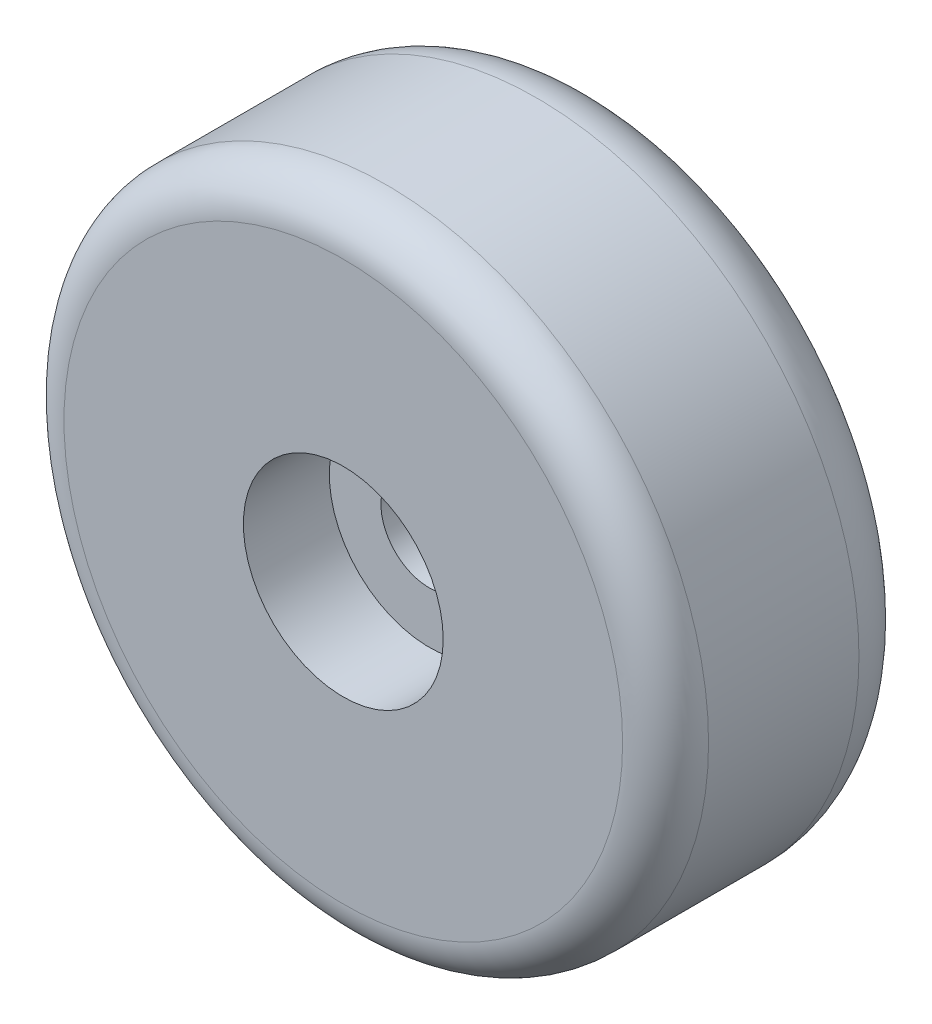
ISO-10303-21;
HEADER;
FILE_DESCRIPTION(('STEP AP214'),'2;1');
FILE_NAME('part.step','',(''),(''),'','','');
FILE_SCHEMA(('AUTOMOTIVE_DESIGN { 1 0 10303 214 1 1 1 1 }'));
ENDSEC;
DATA;
#1=APPLICATION_CONTEXT('core data for automotive mechanical design processes');
#2=APPLICATION_PROTOCOL_DEFINITION('international standard','automotive_design',2000,#1);
#3=PRODUCT_CONTEXT('',#1,'mechanical');
#4=PRODUCT('Part','Part','',(#3));
#5=PRODUCT_RELATED_PRODUCT_CATEGORY('part','',(#4));
#6=PRODUCT_DEFINITION_FORMATION('','',#4);
#7=PRODUCT_DEFINITION_CONTEXT('part definition',#1,'design');
#8=PRODUCT_DEFINITION('design','',#6,#7);
#9=PRODUCT_DEFINITION_SHAPE('','',#8);
#10=(LENGTH_UNIT() NAMED_UNIT(*) SI_UNIT(.MILLI.,.METRE.));
#11=(NAMED_UNIT(*) PLANE_ANGLE_UNIT() SI_UNIT($,.RADIAN.));
#12=(NAMED_UNIT(*) SI_UNIT($,.STERADIAN.) SOLID_ANGLE_UNIT());
#13=UNCERTAINTY_MEASURE_WITH_UNIT(LENGTH_MEASURE(1.E-05),#10,'distance_accuracy_value','');
#14=(GEOMETRIC_REPRESENTATION_CONTEXT(3) GLOBAL_UNCERTAINTY_ASSIGNED_CONTEXT((#13)) GLOBAL_UNIT_ASSIGNED_CONTEXT((#10,
#11,#12)) REPRESENTATION_CONTEXT('',''));
#15=CARTESIAN_POINT('',(0.,0.,0.));
#16=DIRECTION('',(0.,0.,1.));
#17=DIRECTION('',(1.,0.,0.));
#18=AXIS2_PLACEMENT_3D('',#15,#16,#17);
#19=CARTESIAN_POINT('',(0.,0.,12.));
#20=DIRECTION('',(0.,0.,-1.));
#21=DIRECTION('',(-1.,0.,0.));
#22=AXIS2_PLACEMENT_3D('',#19,#20,#21);
#23=CYLINDRICAL_SURFACE('',#22,2.25);
#24=CARTESIAN_POINT('',(0.,0.,0.));
#25=DIRECTION('',(0.,0.,1.));
#26=DIRECTION('',(1.,0.,0.));
#27=AXIS2_PLACEMENT_3D('',#24,#25,#26);
#28=CIRCLE('',#27,2.25);
#29=CARTESIAN_POINT('',(2.25,0.,0.));
#30=VERTEX_POINT('',#29);
#31=EDGE_CURVE('E51',#30,#30,#28,.T.);
#32=ORIENTED_EDGE('',*,*,#31,.F.);
#33=EDGE_LOOP('',(#32));
#34=FACE_BOUND('',#33,.T.);
#35=CARTESIAN_POINT('',(0.,0.,8.));
#36=DIRECTION('',(0.,0.,1.));
#37=DIRECTION('',(1.,0.,0.));
#38=AXIS2_PLACEMENT_3D('',#35,#36,#37);
#39=CIRCLE('',#38,2.25);
#40=CARTESIAN_POINT('',(2.25,0.,8.));
#41=VERTEX_POINT('',#40);
#42=EDGE_CURVE('E52',#41,#41,#39,.T.);
#43=ORIENTED_EDGE('',*,*,#42,.T.);
#44=EDGE_LOOP('',(#43));
#45=FACE_BOUND('',#44,.T.);
#46=ADVANCED_FACE('F31',(#34,#45),#23,.F.);
#47=CARTESIAN_POINT('',(0.,0.,12.));
#48=DIRECTION('',(0.,0.,1.));
#49=DIRECTION('',(1.,0.,0.));
#50=AXIS2_PLACEMENT_3D('',#47,#48,#49);
#51=PLANE('',#50);
#52=CARTESIAN_POINT('',(0.,0.,12.));
#53=DIRECTION('',(0.,0.,1.));
#54=DIRECTION('',(1.,0.,0.));
#55=AXIS2_PLACEMENT_3D('',#52,#53,#54);
#56=CIRCLE('',#55,13.);
#57=CARTESIAN_POINT('',(13.,0.,12.));
#58=VERTEX_POINT('',#57);
#59=EDGE_CURVE('E46',#58,#58,#56,.T.);
#60=ORIENTED_EDGE('',*,*,#59,.T.);
#61=EDGE_LOOP('',(#60));
#62=FACE_BOUND('',#61,.T.);
#63=CARTESIAN_POINT('',(0.,0.,12.));
#64=DIRECTION('',(0.,0.,1.));
#65=DIRECTION('',(1.,0.,0.));
#66=AXIS2_PLACEMENT_3D('',#63,#64,#65);
#67=CIRCLE('',#66,4.65);
#68=CARTESIAN_POINT('',(4.65,0.,12.));
#69=VERTEX_POINT('',#68);
#70=EDGE_CURVE('E58',#69,#69,#67,.T.);
#71=ORIENTED_EDGE('',*,*,#70,.F.);
#72=EDGE_LOOP('',(#71));
#73=FACE_BOUND('',#72,.T.);
#74=ADVANCED_FACE('F73',(#62,#73),#51,.T.);
#75=CARTESIAN_POINT('',(0.,0.,0.));
#76=DIRECTION('',(0.,0.,1.));
#77=DIRECTION('',(1.,0.,0.));
#78=AXIS2_PLACEMENT_3D('',#75,#76,#77);
#79=PLANE('',#78);
#80=CARTESIAN_POINT('',(0.,0.,0.));
#81=DIRECTION('',(0.,0.,1.));
#82=DIRECTION('',(1.,0.,0.));
#83=AXIS2_PLACEMENT_3D('',#80,#81,#82);
#84=CIRCLE('',#83,12.);
#85=CARTESIAN_POINT('',(12.,0.,0.));
#86=VERTEX_POINT('',#85);
#87=EDGE_CURVE('E10',#86,#86,#84,.F.);
#88=ORIENTED_EDGE('',*,*,#87,.T.);
#89=EDGE_LOOP('',(#88));
#90=FACE_BOUND('',#89,.T.);
#91=ORIENTED_EDGE('',*,*,#31,.T.);
#92=EDGE_LOOP('',(#91));
#93=FACE_BOUND('',#92,.T.);
#94=ADVANCED_FACE('F75',(#90,#93),#79,.F.);
#95=CARTESIAN_POINT('',(0.,0.,12.));
#96=DIRECTION('',(0.,0.,-1.));
#97=DIRECTION('',(-1.,0.,0.));
#98=AXIS2_PLACEMENT_3D('',#95,#96,#97);
#99=CYLINDRICAL_SURFACE('',#98,15.);
#100=CARTESIAN_POINT('',(0.,0.,3.));
#101=DIRECTION('',(0.,0.,1.));
#102=DIRECTION('',(1.,0.,0.));
#103=AXIS2_PLACEMENT_3D('',#100,#101,#102);
#104=CIRCLE('',#103,15.);
#105=CARTESIAN_POINT('',(15.,0.,3.));
#106=VERTEX_POINT('',#105);
#107=EDGE_CURVE('E38',#106,#106,#104,.T.);
#108=ORIENTED_EDGE('',*,*,#107,.T.);
#109=EDGE_LOOP('',(#108));
#110=FACE_BOUND('',#109,.T.);
#111=CARTESIAN_POINT('',(0.,0.,10.));
#112=DIRECTION('',(0.,0.,1.));
#113=DIRECTION('',(1.,0.,0.));
#114=AXIS2_PLACEMENT_3D('',#111,#112,#113);
#115=CIRCLE('',#114,15.);
#116=CARTESIAN_POINT('',(15.,0.,10.));
#117=VERTEX_POINT('',#116);
#118=EDGE_CURVE('E42',#117,#117,#115,.F.);
#119=ORIENTED_EDGE('',*,*,#118,.T.);
#120=EDGE_LOOP('',(#119));
#121=FACE_BOUND('',#120,.T.);
#122=ADVANCED_FACE('F69',(#110,#121),#99,.T.);
#123=CARTESIAN_POINT('',(0.,0.,8.));
#124=DIRECTION('',(0.,0.,1.));
#125=DIRECTION('',(1.,0.,0.));
#126=AXIS2_PLACEMENT_3D('',#123,#124,#125);
#127=CYLINDRICAL_SURFACE('',#126,4.65);
#128=CARTESIAN_POINT('',(0.,0.,8.));
#129=DIRECTION('',(0.,0.,1.));
#130=DIRECTION('',(1.,0.,0.));
#131=AXIS2_PLACEMENT_3D('',#128,#129,#130);
#132=CIRCLE('',#131,4.65);
#133=CARTESIAN_POINT('',(4.65,0.,8.));
#134=VERTEX_POINT('',#133);
#135=EDGE_CURVE('E55',#134,#134,#132,.T.);
#136=ORIENTED_EDGE('',*,*,#135,.F.);
#137=EDGE_LOOP('',(#136));
#138=FACE_BOUND('',#137,.T.);
#139=ORIENTED_EDGE('',*,*,#70,.T.);
#140=EDGE_LOOP('',(#139));
#141=FACE_BOUND('',#140,.T.);
#142=ADVANCED_FACE('F66',(#138,#141),#127,.F.);
#143=CARTESIAN_POINT('',(0.,0.,8.));
#144=DIRECTION('',(0.,0.,1.));
#145=DIRECTION('',(1.,0.,0.));
#146=AXIS2_PLACEMENT_3D('',#143,#144,#145);
#147=PLANE('',#146);
#148=ORIENTED_EDGE('',*,*,#42,.F.);
#149=EDGE_LOOP('',(#148));
#150=FACE_BOUND('',#149,.T.);
#151=ORIENTED_EDGE('',*,*,#135,.T.);
#152=EDGE_LOOP('',(#151));
#153=FACE_BOUND('',#152,.T.);
#154=ADVANCED_FACE('F64',(#150,#153),#147,.T.);
#155=CARTESIAN_POINT('',(0.,0.,10.));
#156=DIRECTION('',(0.,0.,1.));
#157=DIRECTION('',(1.,0.,0.));
#158=AXIS2_PLACEMENT_3D('',#155,#156,#157);
#159=TOROIDAL_SURFACE('',#158,13.,2.);
#160=ORIENTED_EDGE('',*,*,#118,.F.);
#161=EDGE_LOOP('',(#160));
#162=FACE_BOUND('',#161,.T.);
#163=ORIENTED_EDGE('',*,*,#59,.F.);
#164=EDGE_LOOP('',(#163));
#165=FACE_BOUND('',#164,.T.);
#166=ADVANCED_FACE('F87',(#162,#165),#159,.T.);
#167=CARTESIAN_POINT('',(0.,0.,3.));
#168=DIRECTION('',(0.,0.,1.));
#169=DIRECTION('',(1.,0.,0.));
#170=AXIS2_PLACEMENT_3D('',#167,#168,#169);
#171=TOROIDAL_SURFACE('',#170,12.,3.);
#172=ORIENTED_EDGE('',*,*,#87,.F.);
#173=EDGE_LOOP('',(#172));
#174=FACE_BOUND('',#173,.T.);
#175=ORIENTED_EDGE('',*,*,#107,.F.);
#176=EDGE_LOOP('',(#175));
#177=FACE_BOUND('',#176,.T.);
#178=ADVANCED_FACE('F33',(#174,#177),#171,.T.);
#179=CLOSED_SHELL('',(#46,#74,#94,#122,#142,#154,#166,#178));
#180=MANIFOLD_SOLID_BREP('B2',#179);
#181=ADVANCED_BREP_SHAPE_REPRESENTATION('',(#18,#180),#14);
#182=SHAPE_DEFINITION_REPRESENTATION(#9,#181);
ENDSEC;
END-ISO-10303-21;
